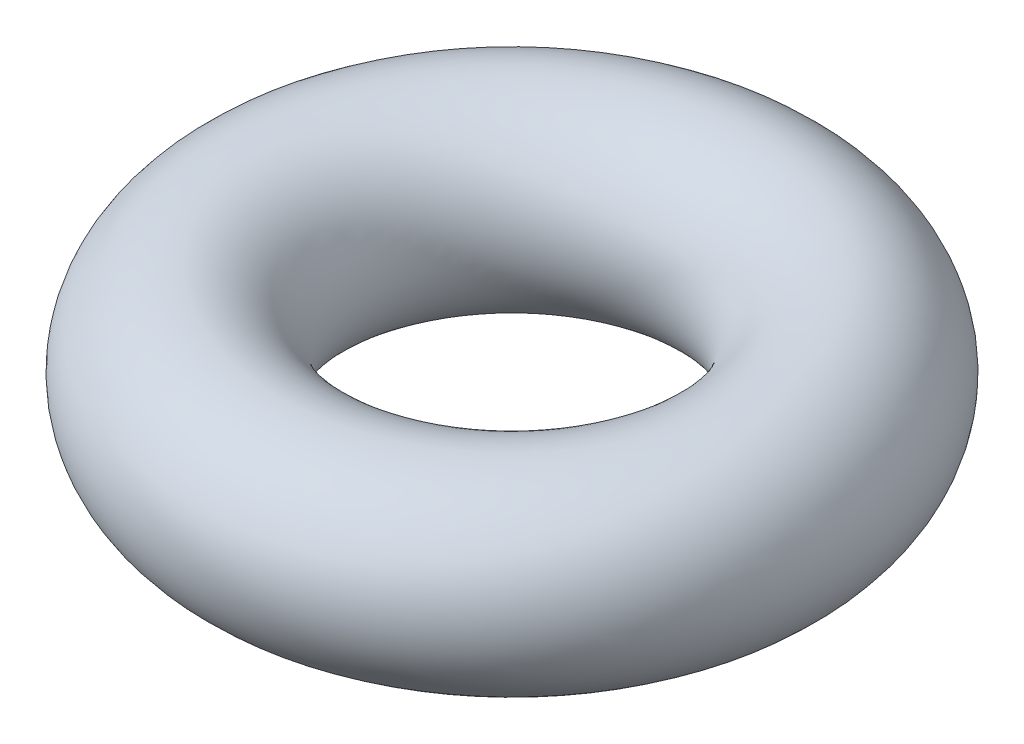
ISO-10303-21;
HEADER;
FILE_DESCRIPTION(('STEP AP214'),'2;1');
FILE_NAME('part.step','',(''),(''),'','','');
FILE_SCHEMA(('AUTOMOTIVE_DESIGN { 1 0 10303 214 1 1 1 1 }'));
ENDSEC;
DATA;
#1=APPLICATION_CONTEXT('core data for automotive mechanical design processes');
#2=APPLICATION_PROTOCOL_DEFINITION('international standard','automotive_design',2000,#1);
#3=PRODUCT_CONTEXT('',#1,'mechanical');
#4=PRODUCT('Part','Part','',(#3));
#5=PRODUCT_RELATED_PRODUCT_CATEGORY('part','',(#4));
#6=PRODUCT_DEFINITION_FORMATION('','',#4);
#7=PRODUCT_DEFINITION_CONTEXT('part definition',#1,'design');
#8=PRODUCT_DEFINITION('design','',#6,#7);
#9=PRODUCT_DEFINITION_SHAPE('','',#8);
#10=(LENGTH_UNIT() NAMED_UNIT(*) SI_UNIT(.MILLI.,.METRE.));
#11=(NAMED_UNIT(*) PLANE_ANGLE_UNIT() SI_UNIT($,.RADIAN.));
#12=(NAMED_UNIT(*) SI_UNIT($,.STERADIAN.) SOLID_ANGLE_UNIT());
#13=UNCERTAINTY_MEASURE_WITH_UNIT(LENGTH_MEASURE(1.E-05),#10,'distance_accuracy_value','');
#14=(GEOMETRIC_REPRESENTATION_CONTEXT(3) GLOBAL_UNCERTAINTY_ASSIGNED_CONTEXT((#13)) GLOBAL_UNIT_ASSIGNED_CONTEXT((#10,
#11,#12)) REPRESENTATION_CONTEXT('',''));
#15=CARTESIAN_POINT('',(0.,0.,0.));
#16=DIRECTION('',(0.,0.,1.));
#17=DIRECTION('',(1.,0.,0.));
#18=AXIS2_PLACEMENT_3D('',#15,#16,#17);
#19=CARTESIAN_POINT('',(63.5,0.,0.));
#20=DIRECTION('',(0.,1.,0.));
#21=DIRECTION('',(0.,0.,1.));
#22=AXIS2_PLACEMENT_3D('',#19,#20,#21);
#23=TOROIDAL_SURFACE('',#22,63.5,25.4);
#24=CARTESIAN_POINT('',(63.5,0.,88.9));
#25=VERTEX_POINT('',#24);
#26=VERTEX_LOOP('',#25);
#27=FACE_BOUND('',#26,.T.);
#28=ADVANCED_FACE('F34',(#27),#23,.T.);
#29=CLOSED_SHELL('',(#28));
#30=CARTESIAN_POINT('',(63.5,0.,0.));
#31=DIRECTION('',(0.,1.,0.));
#32=DIRECTION('',(0.,0.,1.));
#33=AXIS2_PLACEMENT_3D('',#30,#31,#32);
#34=TOROIDAL_SURFACE('',#33,63.5,23.8125);
#35=CARTESIAN_POINT('',(63.5,0.,87.3125));
#36=VERTEX_POINT('',#35);
#37=VERTEX_LOOP('',#36);
#38=FACE_BOUND('',#37,.T.);
#39=ADVANCED_FACE('F47',(#38),#34,.F.);
#40=CLOSED_SHELL('',(#39));
#41=ORIENTED_CLOSED_SHELL('',*,#40,.T.);
#42=BREP_WITH_VOIDS('B2',#29,(#41));
#43=ADVANCED_BREP_SHAPE_REPRESENTATION('',(#18,#42),#14);
#44=SHAPE_DEFINITION_REPRESENTATION(#9,#43);
ENDSEC;
END-ISO-10303-21;
